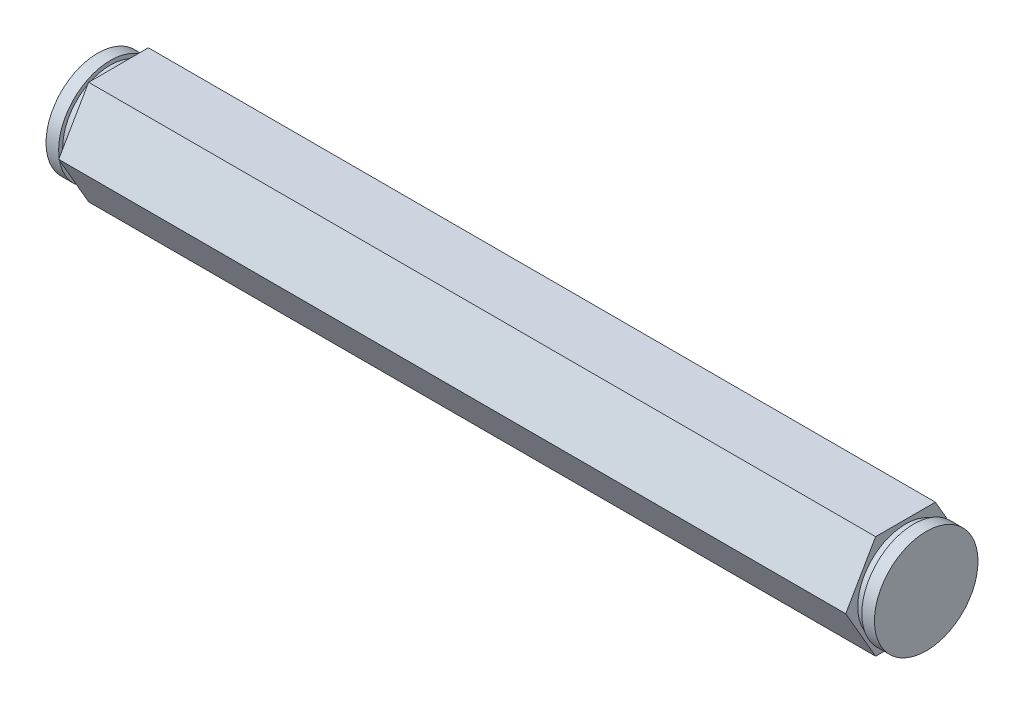
ISO-10303-21;
HEADER;
FILE_DESCRIPTION(('STEP AP214'),'2;1');
FILE_NAME('part.step','',(''),(''),'','','');
FILE_SCHEMA(('AUTOMOTIVE_DESIGN { 1 0 10303 214 1 1 1 1 }'));
ENDSEC;
DATA;
#1=APPLICATION_CONTEXT('core data for automotive mechanical design processes');
#2=APPLICATION_PROTOCOL_DEFINITION('international standard','automotive_design',2000,#1);
#3=PRODUCT_CONTEXT('',#1,'mechanical');
#4=PRODUCT('Part','Part','',(#3));
#5=PRODUCT_RELATED_PRODUCT_CATEGORY('part','',(#4));
#6=PRODUCT_DEFINITION_FORMATION('','',#4);
#7=PRODUCT_DEFINITION_CONTEXT('part definition',#1,'design');
#8=PRODUCT_DEFINITION('design','',#6,#7);
#9=PRODUCT_DEFINITION_SHAPE('','',#8);
#10=(LENGTH_UNIT() NAMED_UNIT(*) SI_UNIT(.MILLI.,.METRE.));
#11=(NAMED_UNIT(*) PLANE_ANGLE_UNIT() SI_UNIT($,.RADIAN.));
#12=(NAMED_UNIT(*) SI_UNIT($,.STERADIAN.) SOLID_ANGLE_UNIT());
#13=UNCERTAINTY_MEASURE_WITH_UNIT(LENGTH_MEASURE(1.E-05),#10,'distance_accuracy_value','');
#14=(GEOMETRIC_REPRESENTATION_CONTEXT(3) GLOBAL_UNCERTAINTY_ASSIGNED_CONTEXT((#13)) GLOBAL_UNIT_ASSIGNED_CONTEXT((#10,
#11,#12)) REPRESENTATION_CONTEXT('',''));
#15=CARTESIAN_POINT('',(0.,0.,0.));
#16=DIRECTION('',(0.,0.,1.));
#17=DIRECTION('',(1.,0.,0.));
#18=AXIS2_PLACEMENT_3D('',#15,#16,#17);
#19=CARTESIAN_POINT('',(50.8,-6.34999999999993,-3.66617420935418));
#20=DIRECTION('',(0.,0.499999999999995,0.866025403784441));
#21=DIRECTION('',(0.,-0.866025403784441,0.499999999999995));
#22=AXIS2_PLACEMENT_3D('',#19,#20,#21);
#23=PLANE('',#22);
#24=DIRECTION('',(-1.,0.,0.));
#25=VECTOR('',#24,1.);
#26=CARTESIAN_POINT('',(50.8,-6.34999999999993,-3.66617420935418));
#27=LINE('',#26,#25);
#28=CARTESIAN_POINT('',(48.26,-6.34999999999993,-3.66617420935418));
#29=VERTEX_POINT('',#28);
#30=CARTESIAN_POINT('',(-48.26,-6.34999999999993,-3.66617420935418));
#31=VERTEX_POINT('',#30);
#32=EDGE_CURVE('E105',#29,#31,#27,.T.);
#33=ORIENTED_EDGE('',*,*,#32,.T.);
#34=DIRECTION('',(0.,0.866025403784441,-0.499999999999995));
#35=VECTOR('',#34,1.);
#36=CARTESIAN_POINT('',(-48.26,-6.34999999999993,-3.66617420935418));
#37=LINE('',#36,#35);
#38=CARTESIAN_POINT('',(-48.26,0.,-7.33234841870821));
#39=VERTEX_POINT('',#38);
#40=EDGE_CURVE('E51',#31,#39,#37,.T.);
#41=ORIENTED_EDGE('',*,*,#40,.T.);
#42=DIRECTION('',(-1.,0.,0.));
#43=VECTOR('',#42,1.);
#44=CARTESIAN_POINT('',(50.8,0.,-7.33234841870821));
#45=LINE('',#44,#43);
#46=CARTESIAN_POINT('',(48.26,0.,-7.33234841870821));
#47=VERTEX_POINT('',#46);
#48=EDGE_CURVE('E118',#47,#39,#45,.T.);
#49=ORIENTED_EDGE('',*,*,#48,.F.);
#50=DIRECTION('',(0.,-0.866025403784441,0.499999999999995));
#51=VECTOR('',#50,1.);
#52=CARTESIAN_POINT('',(48.26,-6.34999999999993,-3.66617420935418));
#53=LINE('',#52,#51);
#54=EDGE_CURVE('E109',#47,#29,#53,.T.);
#55=ORIENTED_EDGE('',*,*,#54,.T.);
#56=EDGE_LOOP('',(#33,#41,#49,#55));
#57=FACE_BOUND('',#56,.T.);
#58=ADVANCED_FACE('F37',(#57),#23,.F.);
#59=CARTESIAN_POINT('',(50.8,0.,-7.33234841870821));
#60=DIRECTION('',(0.,-0.500000000000001,0.866025403784438));
#61=DIRECTION('',(0.,-0.866025403784438,-0.500000000000001));
#62=AXIS2_PLACEMENT_3D('',#59,#60,#61);
#63=PLANE('',#62);
#64=ORIENTED_EDGE('',*,*,#48,.T.);
#65=DIRECTION('',(0.,0.866025403784438,0.500000000000001));
#66=VECTOR('',#65,1.);
#67=CARTESIAN_POINT('',(-48.26,0.,-7.33234841870821));
#68=LINE('',#67,#66);
#69=CARTESIAN_POINT('',(-48.26,6.34999999999998,-3.66617420935409));
#70=VERTEX_POINT('',#69);
#71=EDGE_CURVE('E149',#39,#70,#68,.T.);
#72=ORIENTED_EDGE('',*,*,#71,.T.);
#73=DIRECTION('',(-1.,0.,0.));
#74=VECTOR('',#73,1.);
#75=CARTESIAN_POINT('',(50.8,6.34999999999998,-3.66617420935409));
#76=LINE('',#75,#74);
#77=CARTESIAN_POINT('',(48.26,6.34999999999998,-3.66617420935409));
#78=VERTEX_POINT('',#77);
#79=EDGE_CURVE('E115',#78,#70,#76,.T.);
#80=ORIENTED_EDGE('',*,*,#79,.F.);
#81=DIRECTION('',(0.,-0.866025403784438,-0.500000000000001));
#82=VECTOR('',#81,1.);
#83=CARTESIAN_POINT('',(48.26,0.,-7.33234841870821));
#84=LINE('',#83,#82);
#85=EDGE_CURVE('E169',#78,#47,#84,.T.);
#86=ORIENTED_EDGE('',*,*,#85,.T.);
#87=EDGE_LOOP('',(#64,#72,#80,#86));
#88=FACE_BOUND('',#87,.T.);
#89=ADVANCED_FACE('F177',(#88),#63,.F.);
#90=CARTESIAN_POINT('',(50.8,6.34999999999998,-3.66617420935409));
#91=DIRECTION('',(0.,-1.,0.));
#92=DIRECTION('',(0.,0.,-1.));
#93=AXIS2_PLACEMENT_3D('',#90,#91,#92);
#94=PLANE('',#93);
#95=ORIENTED_EDGE('',*,*,#79,.T.);
#96=DIRECTION('',(0.,0.,1.));
#97=VECTOR('',#96,1.);
#98=CARTESIAN_POINT('',(-48.26,6.34999999999998,-3.66617420935409));
#99=LINE('',#98,#97);
#100=CARTESIAN_POINT('',(-48.26,6.34999999999995,3.66617420935414));
#101=VERTEX_POINT('',#100);
#102=EDGE_CURVE('E146',#70,#101,#99,.T.);
#103=ORIENTED_EDGE('',*,*,#102,.T.);
#104=DIRECTION('',(-1.,0.,0.));
#105=VECTOR('',#104,1.);
#106=CARTESIAN_POINT('',(50.8,6.34999999999995,3.66617420935414));
#107=LINE('',#106,#105);
#108=CARTESIAN_POINT('',(48.26,6.34999999999995,3.66617420935414));
#109=VERTEX_POINT('',#108);
#110=EDGE_CURVE('E107',#109,#101,#107,.T.);
#111=ORIENTED_EDGE('',*,*,#110,.F.);
#112=DIRECTION('',(0.,0.,-1.));
#113=VECTOR('',#112,1.);
#114=CARTESIAN_POINT('',(48.26,6.34999999999998,-3.66617420935409));
#115=LINE('',#114,#113);
#116=EDGE_CURVE('E166',#109,#78,#115,.T.);
#117=ORIENTED_EDGE('',*,*,#116,.T.);
#118=EDGE_LOOP('',(#95,#103,#111,#117));
#119=FACE_BOUND('',#118,.T.);
#120=ADVANCED_FACE('F179',(#119),#94,.F.);
#121=CARTESIAN_POINT('',(50.8,6.34999999999995,3.66617420935414));
#122=DIRECTION('',(0.,-0.499999999999995,-0.866025403784442));
#123=DIRECTION('',(0.,0.866025403784442,-0.499999999999995));
#124=AXIS2_PLACEMENT_3D('',#121,#122,#123);
#125=PLANE('',#124);
#126=ORIENTED_EDGE('',*,*,#110,.T.);
#127=DIRECTION('',(0.,-0.866025403784442,0.499999999999995));
#128=VECTOR('',#127,1.);
#129=CARTESIAN_POINT('',(-48.26,6.34999999999995,3.66617420935414));
#130=LINE('',#129,#128);
#131=CARTESIAN_POINT('',(-48.26,0.,7.33234841870821));
#132=VERTEX_POINT('',#131);
#133=EDGE_CURVE('E100',#101,#132,#130,.T.);
#134=ORIENTED_EDGE('',*,*,#133,.T.);
#135=DIRECTION('',(-1.,0.,0.));
#136=VECTOR('',#135,1.);
#137=CARTESIAN_POINT('',(50.8,0.,7.33234841870821));
#138=LINE('',#137,#136);
#139=CARTESIAN_POINT('',(48.26,0.,7.33234841870821));
#140=VERTEX_POINT('',#139);
#141=EDGE_CURVE('E99',#140,#132,#138,.T.);
#142=ORIENTED_EDGE('',*,*,#141,.F.);
#143=DIRECTION('',(0.,0.866025403784442,-0.499999999999995));
#144=VECTOR('',#143,1.);
#145=CARTESIAN_POINT('',(48.26,6.34999999999995,3.66617420935414));
#146=LINE('',#145,#144);
#147=EDGE_CURVE('E163',#140,#109,#146,.T.);
#148=ORIENTED_EDGE('',*,*,#147,.T.);
#149=EDGE_LOOP('',(#126,#134,#142,#148));
#150=FACE_BOUND('',#149,.T.);
#151=ADVANCED_FACE('F182',(#150),#125,.F.);
#152=CARTESIAN_POINT('',(50.8,0.,7.33234841870821));
#153=DIRECTION('',(0.,0.500000000000007,-0.866025403784435));
#154=DIRECTION('',(0.,0.866025403784435,0.500000000000007));
#155=AXIS2_PLACEMENT_3D('',#152,#153,#154);
#156=PLANE('',#155);
#157=ORIENTED_EDGE('',*,*,#141,.T.);
#158=DIRECTION('',(0.,-0.866025403784435,-0.500000000000007));
#159=VECTOR('',#158,1.);
#160=CARTESIAN_POINT('',(-48.26,0.,7.33234841870821));
#161=LINE('',#160,#159);
#162=CARTESIAN_POINT('',(-48.26,-6.35,3.66617420935405));
#163=VERTEX_POINT('',#162);
#164=EDGE_CURVE('E87',#132,#163,#161,.T.);
#165=ORIENTED_EDGE('',*,*,#164,.T.);
#166=DIRECTION('',(-1.,0.,0.));
#167=VECTOR('',#166,1.);
#168=CARTESIAN_POINT('',(50.8,-6.35,3.66617420935405));
#169=LINE('',#168,#167);
#170=CARTESIAN_POINT('',(48.26,-6.35,3.66617420935405));
#171=VERTEX_POINT('',#170);
#172=EDGE_CURVE('E97',#171,#163,#169,.T.);
#173=ORIENTED_EDGE('',*,*,#172,.F.);
#174=DIRECTION('',(0.,0.866025403784435,0.500000000000007));
#175=VECTOR('',#174,1.);
#176=CARTESIAN_POINT('',(48.26,0.,7.33234841870821));
#177=LINE('',#176,#175);
#178=EDGE_CURVE('E58',#171,#140,#177,.T.);
#179=ORIENTED_EDGE('',*,*,#178,.T.);
#180=EDGE_LOOP('',(#157,#165,#173,#179));
#181=FACE_BOUND('',#180,.T.);
#182=ADVANCED_FACE('F96',(#181),#156,.F.);
#183=CARTESIAN_POINT('',(50.8,-6.35,3.66617420935405));
#184=DIRECTION('',(0.,1.,0.));
#185=DIRECTION('',(0.,0.,1.));
#186=AXIS2_PLACEMENT_3D('',#183,#184,#185);
#187=PLANE('',#186);
#188=ORIENTED_EDGE('',*,*,#172,.T.);
#189=DIRECTION('',(0.,0.,-1.));
#190=VECTOR('',#189,1.);
#191=CARTESIAN_POINT('',(-48.26,-6.35,3.66617420935405));
#192=LINE('',#191,#190);
#193=EDGE_CURVE('E11',#163,#31,#192,.T.);
#194=ORIENTED_EDGE('',*,*,#193,.T.);
#195=ORIENTED_EDGE('',*,*,#32,.F.);
#196=DIRECTION('',(0.,0.,1.));
#197=VECTOR('',#196,1.);
#198=CARTESIAN_POINT('',(48.26,-6.35,3.66617420935405));
#199=LINE('',#198,#197);
#200=EDGE_CURVE('E104',#29,#171,#199,.T.);
#201=ORIENTED_EDGE('',*,*,#200,.T.);
#202=EDGE_LOOP('',(#188,#194,#195,#201));
#203=FACE_BOUND('',#202,.T.);
#204=ADVANCED_FACE('F103',(#203),#187,.F.);
#205=CARTESIAN_POINT('',(48.26,0.,8.89));
#206=DIRECTION('',(-1.,0.,0.));
#207=DIRECTION('',(0.,0.,1.));
#208=AXIS2_PLACEMENT_3D('',#205,#206,#207);
#209=PLANE('',#208);
#210=CARTESIAN_POINT('',(48.26,0.,0.));
#211=DIRECTION('',(-1.,0.,0.));
#212=DIRECTION('',(0.,0.,1.));
#213=AXIS2_PLACEMENT_3D('',#210,#211,#212);
#214=CIRCLE('',#213,5.8547);
#215=CARTESIAN_POINT('',(48.26,0.,5.8547));
#216=VERTEX_POINT('',#215);
#217=EDGE_CURVE('E159',#216,#216,#214,.T.);
#218=ORIENTED_EDGE('',*,*,#217,.T.);
#219=EDGE_LOOP('',(#218));
#220=FACE_BOUND('',#219,.T.);
#221=ORIENTED_EDGE('',*,*,#85,.F.);
#222=ORIENTED_EDGE('',*,*,#116,.F.);
#223=ORIENTED_EDGE('',*,*,#147,.F.);
#224=ORIENTED_EDGE('',*,*,#178,.F.);
#225=ORIENTED_EDGE('',*,*,#200,.F.);
#226=ORIENTED_EDGE('',*,*,#54,.F.);
#227=EDGE_LOOP('',(#221,#222,#223,#224,#225,#226));
#228=FACE_BOUND('',#227,.T.);
#229=ADVANCED_FACE('F174',(#220,#228),#209,.F.);
#230=CARTESIAN_POINT('',(0.,0.,0.));
#231=DIRECTION('',(-1.,0.,0.));
#232=DIRECTION('',(0.,0.,1.));
#233=AXIS2_PLACEMENT_3D('',#230,#231,#232);
#234=CYLINDRICAL_SURFACE('',#233,6.35);
#235=CARTESIAN_POINT('',(50.8,0.,0.));
#236=DIRECTION('',(1.,0.,0.));
#237=DIRECTION('',(0.,0.,-1.));
#238=AXIS2_PLACEMENT_3D('',#235,#236,#237);
#239=CIRCLE('',#238,6.35);
#240=CARTESIAN_POINT('',(50.8,0.,-6.35));
#241=VERTEX_POINT('',#240);
#242=EDGE_CURVE('E121',#241,#241,#239,.F.);
#243=ORIENTED_EDGE('',*,*,#242,.T.);
#244=EDGE_LOOP('',(#243));
#245=FACE_BOUND('',#244,.T.);
#246=CARTESIAN_POINT('',(49.2506,0.,0.));
#247=DIRECTION('',(-1.,0.,0.));
#248=DIRECTION('',(0.,0.,1.));
#249=AXIS2_PLACEMENT_3D('',#246,#247,#248);
#250=CIRCLE('',#249,6.35);
#251=CARTESIAN_POINT('',(49.2506,0.,6.35));
#252=VERTEX_POINT('',#251);
#253=EDGE_CURVE('E153',#252,#252,#250,.T.);
#254=ORIENTED_EDGE('',*,*,#253,.F.);
#255=EDGE_LOOP('',(#254));
#256=FACE_BOUND('',#255,.T.);
#257=ADVANCED_FACE('F299',(#245,#256),#234,.T.);
#258=CARTESIAN_POINT('',(0.,0.,0.));
#259=DIRECTION('',(-1.,0.,0.));
#260=DIRECTION('',(0.,0.,1.));
#261=AXIS2_PLACEMENT_3D('',#258,#259,#260);
#262=CYLINDRICAL_SURFACE('',#261,5.8547);
#263=ORIENTED_EDGE('',*,*,#217,.F.);
#264=EDGE_LOOP('',(#263));
#265=FACE_BOUND('',#264,.T.);
#266=CARTESIAN_POINT('',(49.2506,0.,0.));
#267=DIRECTION('',(-1.,0.,0.));
#268=DIRECTION('',(0.,0.,1.));
#269=AXIS2_PLACEMENT_3D('',#266,#267,#268);
#270=CIRCLE('',#269,5.8547);
#271=CARTESIAN_POINT('',(49.2506,0.,5.8547));
#272=VERTEX_POINT('',#271);
#273=EDGE_CURVE('E156',#272,#272,#270,.T.);
#274=ORIENTED_EDGE('',*,*,#273,.T.);
#275=EDGE_LOOP('',(#274));
#276=FACE_BOUND('',#275,.T.);
#277=ADVANCED_FACE('F287',(#265,#276),#262,.T.);
#278=CARTESIAN_POINT('',(49.2506,0.,5.8547));
#279=DIRECTION('',(1.,0.,0.));
#280=DIRECTION('',(0.,0.,-1.));
#281=AXIS2_PLACEMENT_3D('',#278,#279,#280);
#282=PLANE('',#281);
#283=ORIENTED_EDGE('',*,*,#273,.F.);
#284=EDGE_LOOP('',(#283));
#285=FACE_BOUND('',#284,.T.);
#286=ORIENTED_EDGE('',*,*,#253,.T.);
#287=EDGE_LOOP('',(#286));
#288=FACE_BOUND('',#287,.T.);
#289=ADVANCED_FACE('F281',(#285,#288),#282,.F.);
#290=CARTESIAN_POINT('',(50.8,0.,0.));
#291=DIRECTION('',(1.,0.,0.));
#292=DIRECTION('',(0.,0.,-1.));
#293=AXIS2_PLACEMENT_3D('',#290,#291,#292);
#294=PLANE('',#293);
#295=ORIENTED_EDGE('',*,*,#242,.F.);
#296=EDGE_LOOP('',(#295));
#297=FACE_BOUND('',#296,.T.);
#298=ADVANCED_FACE('F234',(#297),#294,.T.);
#299=CARTESIAN_POINT('',(-48.26,0.,8.89));
#300=DIRECTION('',(1.,0.,0.));
#301=DIRECTION('',(0.,0.,1.));
#302=AXIS2_PLACEMENT_3D('',#299,#300,#301);
#303=PLANE('',#302);
#304=CARTESIAN_POINT('',(-48.26,0.,0.));
#305=DIRECTION('',(-1.,0.,0.));
#306=DIRECTION('',(0.,0.,1.));
#307=AXIS2_PLACEMENT_3D('',#304,#305,#306);
#308=CIRCLE('',#307,5.8547);
#309=CARTESIAN_POINT('',(-48.26,0.,5.8547));
#310=VERTEX_POINT('',#309);
#311=EDGE_CURVE('E101',#310,#310,#308,.T.);
#312=ORIENTED_EDGE('',*,*,#311,.F.);
#313=EDGE_LOOP('',(#312));
#314=FACE_BOUND('',#313,.T.);
#315=ORIENTED_EDGE('',*,*,#193,.F.);
#316=ORIENTED_EDGE('',*,*,#164,.F.);
#317=ORIENTED_EDGE('',*,*,#133,.F.);
#318=ORIENTED_EDGE('',*,*,#102,.F.);
#319=ORIENTED_EDGE('',*,*,#71,.F.);
#320=ORIENTED_EDGE('',*,*,#40,.F.);
#321=EDGE_LOOP('',(#315,#316,#317,#318,#319,#320));
#322=FACE_BOUND('',#321,.T.);
#323=ADVANCED_FACE('F86',(#314,#322),#303,.F.);
#324=CARTESIAN_POINT('',(0.,0.,0.));
#325=DIRECTION('',(1.,0.,0.));
#326=DIRECTION('',(0.,0.,1.));
#327=AXIS2_PLACEMENT_3D('',#324,#325,#326);
#328=CYLINDRICAL_SURFACE('',#327,6.35);
#329=CARTESIAN_POINT('',(-50.8,0.,0.));
#330=DIRECTION('',(1.,0.,0.));
#331=DIRECTION('',(0.,0.,-1.));
#332=AXIS2_PLACEMENT_3D('',#329,#330,#331);
#333=CIRCLE('',#332,6.35);
#334=CARTESIAN_POINT('',(-50.8,0.,-6.35));
#335=VERTEX_POINT('',#334);
#336=EDGE_CURVE('E44',#335,#335,#333,.F.);
#337=ORIENTED_EDGE('',*,*,#336,.F.);
#338=EDGE_LOOP('',(#337));
#339=FACE_BOUND('',#338,.T.);
#340=CARTESIAN_POINT('',(-49.2506,0.,0.));
#341=DIRECTION('',(-1.,0.,0.));
#342=DIRECTION('',(0.,0.,1.));
#343=AXIS2_PLACEMENT_3D('',#340,#341,#342);
#344=CIRCLE('',#343,6.35);
#345=CARTESIAN_POINT('',(-49.2506,0.,6.35));
#346=VERTEX_POINT('',#345);
#347=EDGE_CURVE('E136',#346,#346,#344,.T.);
#348=ORIENTED_EDGE('',*,*,#347,.T.);
#349=EDGE_LOOP('',(#348));
#350=FACE_BOUND('',#349,.T.);
#351=ADVANCED_FACE('F129',(#339,#350),#328,.T.);
#352=CARTESIAN_POINT('',(0.,0.,0.));
#353=DIRECTION('',(1.,0.,0.));
#354=DIRECTION('',(0.,0.,1.));
#355=AXIS2_PLACEMENT_3D('',#352,#353,#354);
#356=CYLINDRICAL_SURFACE('',#355,5.8547);
#357=ORIENTED_EDGE('',*,*,#311,.T.);
#358=EDGE_LOOP('',(#357));
#359=FACE_BOUND('',#358,.T.);
#360=CARTESIAN_POINT('',(-49.2506,0.,0.));
#361=DIRECTION('',(-1.,0.,0.));
#362=DIRECTION('',(0.,0.,1.));
#363=AXIS2_PLACEMENT_3D('',#360,#361,#362);
#364=CIRCLE('',#363,5.8547);
#365=CARTESIAN_POINT('',(-49.2506,0.,5.8547));
#366=VERTEX_POINT('',#365);
#367=EDGE_CURVE('E138',#366,#366,#364,.T.);
#368=ORIENTED_EDGE('',*,*,#367,.F.);
#369=EDGE_LOOP('',(#368));
#370=FACE_BOUND('',#369,.T.);
#371=ADVANCED_FACE('F132',(#359,#370),#356,.T.);
#372=CARTESIAN_POINT('',(-49.2506,0.,5.8547));
#373=DIRECTION('',(-1.,0.,0.));
#374=DIRECTION('',(0.,0.,-1.));
#375=AXIS2_PLACEMENT_3D('',#372,#373,#374);
#376=PLANE('',#375);
#377=ORIENTED_EDGE('',*,*,#367,.T.);
#378=EDGE_LOOP('',(#377));
#379=FACE_BOUND('',#378,.T.);
#380=ORIENTED_EDGE('',*,*,#347,.F.);
#381=EDGE_LOOP('',(#380));
#382=FACE_BOUND('',#381,.T.);
#383=ADVANCED_FACE('F254',(#379,#382),#376,.F.);
#384=CARTESIAN_POINT('',(-50.8,0.,0.));
#385=DIRECTION('',(1.,0.,0.));
#386=DIRECTION('',(0.,0.,-1.));
#387=AXIS2_PLACEMENT_3D('',#384,#385,#386);
#388=PLANE('',#387);
#389=ORIENTED_EDGE('',*,*,#336,.T.);
#390=EDGE_LOOP('',(#389));
#391=FACE_BOUND('',#390,.T.);
#392=ADVANCED_FACE('F127',(#391),#388,.F.);
#393=CLOSED_SHELL('',(#58,#89,#120,#151,#182,#204,#229,#257,#277,#289,#298,#323,#351,#371,#383,#392));
#394=MANIFOLD_SOLID_BREP('B2',#393);
#395=ADVANCED_BREP_SHAPE_REPRESENTATION('',(#18,#394),#14);
#396=SHAPE_DEFINITION_REPRESENTATION(#9,#395);
ENDSEC;
END-ISO-10303-21;
